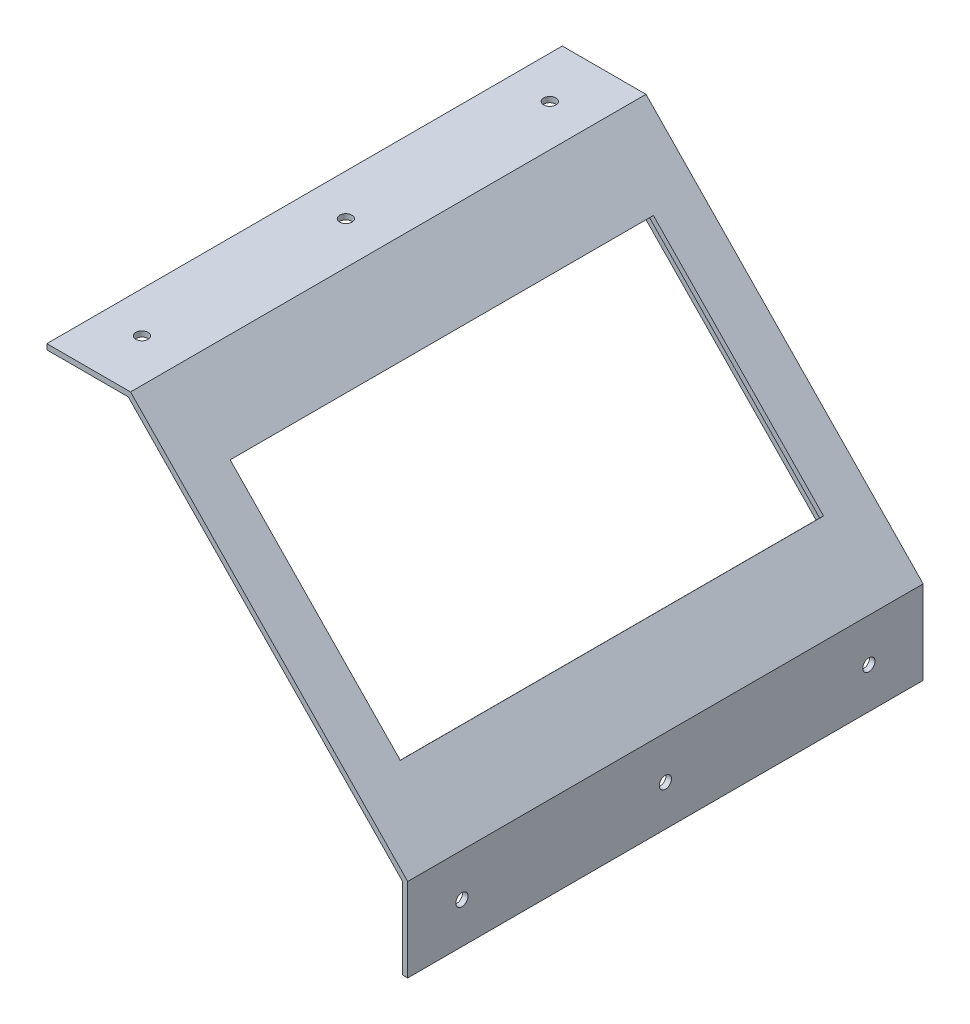
ISO-10303-21;
HEADER;
FILE_DESCRIPTION(('STEP AP214'),'2;1');
FILE_NAME('part.step','',(''),(''),'','','');
FILE_SCHEMA(('AUTOMOTIVE_DESIGN { 1 0 10303 214 1 1 1 1 }'));
ENDSEC;
DATA;
#1=APPLICATION_CONTEXT('core data for automotive mechanical design processes');
#2=APPLICATION_PROTOCOL_DEFINITION('international standard','automotive_design',2000,#1);
#3=PRODUCT_CONTEXT('',#1,'mechanical');
#4=PRODUCT('Part','Part','',(#3));
#5=PRODUCT_RELATED_PRODUCT_CATEGORY('part','',(#4));
#6=PRODUCT_DEFINITION_FORMATION('','',#4);
#7=PRODUCT_DEFINITION_CONTEXT('part definition',#1,'design');
#8=PRODUCT_DEFINITION('design','',#6,#7);
#9=PRODUCT_DEFINITION_SHAPE('','',#8);
#10=(LENGTH_UNIT() NAMED_UNIT(*) SI_UNIT(.MILLI.,.METRE.));
#11=(NAMED_UNIT(*) PLANE_ANGLE_UNIT() SI_UNIT($,.RADIAN.));
#12=(NAMED_UNIT(*) SI_UNIT($,.STERADIAN.) SOLID_ANGLE_UNIT());
#13=UNCERTAINTY_MEASURE_WITH_UNIT(LENGTH_MEASURE(1.E-05),#10,'distance_accuracy_value','');
#14=(GEOMETRIC_REPRESENTATION_CONTEXT(3) GLOBAL_UNCERTAINTY_ASSIGNED_CONTEXT((#13)) GLOBAL_UNIT_ASSIGNED_CONTEXT((#10,
#11,#12)) REPRESENTATION_CONTEXT('',''));
#15=CARTESIAN_POINT('',(0.,0.,0.));
#16=DIRECTION('',(0.,0.,1.));
#17=DIRECTION('',(1.,0.,0.));
#18=AXIS2_PLACEMENT_3D('',#15,#16,#17);
#19=CARTESIAN_POINT('',(-64.5,38.,95.));
#20=DIRECTION('',(0.,0.,1.));
#21=DIRECTION('',(1.,0.,0.));
#22=AXIS2_PLACEMENT_3D('',#19,#20,#21);
#23=PLANE('',#22);
#24=DIRECTION('',(1.,0.,0.));
#25=VECTOR('',#24,1.);
#26=CARTESIAN_POINT('',(-131.,104.,95.));
#27=LINE('',#26,#25);
#28=CARTESIAN_POINT('',(-131.,104.,95.));
#29=VERTEX_POINT('',#28);
#30=CARTESIAN_POINT('',(-101.,104.,95.));
#31=VERTEX_POINT('',#30);
#32=EDGE_CURVE('E10',#29,#31,#27,.T.);
#33=ORIENTED_EDGE('',*,*,#32,.T.);
#34=DIRECTION('',(0.696684280725865,-0.717377873222672,0.));
#35=VECTOR('',#34,1.);
#36=CARTESIAN_POINT('',(-101.,104.,95.));
#37=LINE('',#36,#35);
#38=CARTESIAN_POINT('',(0.,0.,95.));
#39=VERTEX_POINT('',#38);
#40=EDGE_CURVE('E324',#31,#39,#37,.T.);
#41=ORIENTED_EDGE('',*,*,#40,.T.);
#42=DIRECTION('',(0.,-1.,0.));
#43=VECTOR('',#42,1.);
#44=CARTESIAN_POINT('',(0.,0.,95.));
#45=LINE('',#44,#43);
#46=CARTESIAN_POINT('',(0.,-30.,95.));
#47=VERTEX_POINT('',#46);
#48=EDGE_CURVE('E25',#39,#47,#45,.T.);
#49=ORIENTED_EDGE('',*,*,#48,.T.);
#50=DIRECTION('',(1.,0.,0.));
#51=VECTOR('',#50,1.);
#52=CARTESIAN_POINT('',(0.,-30.,95.));
#53=LINE('',#52,#51);
#54=CARTESIAN_POINT('',(2.,-30.,95.));
#55=VERTEX_POINT('',#54);
#56=EDGE_CURVE('E47',#47,#55,#53,.T.);
#57=ORIENTED_EDGE('',*,*,#56,.T.);
#58=DIRECTION('',(0.,1.,0.));
#59=VECTOR('',#58,1.);
#60=CARTESIAN_POINT('',(2.,-30.,95.));
#61=LINE('',#60,#59);
#62=CARTESIAN_POINT('',(2.,0.811334874623189,95.));
#63=VERTEX_POINT('',#62);
#64=EDGE_CURVE('E337',#55,#63,#61,.T.);
#65=ORIENTED_EDGE('',*,*,#64,.T.);
#66=DIRECTION('',(-0.696684280725865,0.717377873222672,0.));
#67=VECTOR('',#66,1.);
#68=CARTESIAN_POINT('',(2.,0.811334874623189,95.));
#69=LINE('',#68,#67);
#70=CARTESIAN_POINT('',(-100.154376708299,106.,95.));
#71=VERTEX_POINT('',#70);
#72=EDGE_CURVE('E370',#63,#71,#69,.T.);
#73=ORIENTED_EDGE('',*,*,#72,.T.);
#74=DIRECTION('',(-1.,0.,0.));
#75=VECTOR('',#74,1.);
#76=CARTESIAN_POINT('',(-100.154376708299,106.,95.));
#77=LINE('',#76,#75);
#78=CARTESIAN_POINT('',(-131.,106.,95.));
#79=VERTEX_POINT('',#78);
#80=EDGE_CURVE('E371',#71,#79,#77,.T.);
#81=ORIENTED_EDGE('',*,*,#80,.T.);
#82=DIRECTION('',(0.,-1.,0.));
#83=VECTOR('',#82,1.);
#84=CARTESIAN_POINT('',(-131.,106.,95.));
#85=LINE('',#84,#83);
#86=EDGE_CURVE('E291',#79,#29,#85,.T.);
#87=ORIENTED_EDGE('',*,*,#86,.T.);
#88=EDGE_LOOP('',(#33,#41,#49,#57,#65,#73,#81,#87));
#89=FACE_BOUND('',#88,.T.);
#90=ADVANCED_FACE('F15',(#89),#23,.T.);
#91=CARTESIAN_POINT('',(-131.,104.,0.));
#92=DIRECTION('',(0.,-1.,0.));
#93=DIRECTION('',(0.,0.,-1.));
#94=AXIS2_PLACEMENT_3D('',#91,#92,#93);
#95=PLANE('',#94);
#96=CARTESIAN_POINT('',(-115.621694843186,104.,-75.));
#97=DIRECTION('',(0.,1.,0.));
#98=DIRECTION('',(1.,0.,0.));
#99=AXIS2_PLACEMENT_3D('',#96,#97,#98);
#100=CIRCLE('',#99,2.25);
#101=CARTESIAN_POINT('',(-117.871694843186,104.,-75.));
#102=VERTEX_POINT('',#101);
#103=EDGE_CURVE('E261',#102,#102,#100,.T.);
#104=ORIENTED_EDGE('',*,*,#103,.T.);
#105=EDGE_LOOP('',(#104));
#106=FACE_BOUND('',#105,.T.);
#107=CARTESIAN_POINT('',(-115.788594177075,104.,0.));
#108=DIRECTION('',(0.,1.,0.));
#109=DIRECTION('',(1.,0.,0.));
#110=AXIS2_PLACEMENT_3D('',#107,#108,#109);
#111=CIRCLE('',#110,2.25);
#112=CARTESIAN_POINT('',(-118.038594177075,104.,0.));
#113=VERTEX_POINT('',#112);
#114=EDGE_CURVE('E272',#113,#113,#111,.T.);
#115=ORIENTED_EDGE('',*,*,#114,.T.);
#116=EDGE_LOOP('',(#115));
#117=FACE_BOUND('',#116,.T.);
#118=CARTESIAN_POINT('',(-115.955493510963,104.,75.));
#119=DIRECTION('',(0.,1.,0.));
#120=DIRECTION('',(1.,0.,0.));
#121=AXIS2_PLACEMENT_3D('',#118,#119,#120);
#122=CIRCLE('',#121,2.25);
#123=CARTESIAN_POINT('',(-118.205493510963,104.,75.));
#124=VERTEX_POINT('',#123);
#125=EDGE_CURVE('E426',#124,#124,#122,.T.);
#126=ORIENTED_EDGE('',*,*,#125,.T.);
#127=EDGE_LOOP('',(#126));
#128=FACE_BOUND('',#127,.T.);
#129=DIRECTION('',(0.,0.,1.));
#130=VECTOR('',#129,1.);
#131=CARTESIAN_POINT('',(-101.,104.,0.));
#132=LINE('',#131,#130);
#133=CARTESIAN_POINT('',(-101.,104.,-95.));
#134=VERTEX_POINT('',#133);
#135=EDGE_CURVE('E327',#134,#31,#132,.T.);
#136=ORIENTED_EDGE('',*,*,#135,.T.);
#137=ORIENTED_EDGE('',*,*,#32,.F.);
#138=DIRECTION('',(0.,0.,-1.));
#139=VECTOR('',#138,1.);
#140=CARTESIAN_POINT('',(-131.,104.,0.));
#141=LINE('',#140,#139);
#142=CARTESIAN_POINT('',(-131.,104.,-95.));
#143=VERTEX_POINT('',#142);
#144=EDGE_CURVE('E288',#29,#143,#141,.T.);
#145=ORIENTED_EDGE('',*,*,#144,.T.);
#146=DIRECTION('',(-1.,0.,0.));
#147=VECTOR('',#146,1.);
#148=CARTESIAN_POINT('',(-131.,104.,-95.));
#149=LINE('',#148,#147);
#150=EDGE_CURVE('E390',#134,#143,#149,.T.);
#151=ORIENTED_EDGE('',*,*,#150,.F.);
#152=EDGE_LOOP('',(#136,#137,#145,#151));
#153=FACE_BOUND('',#152,.T.);
#154=ADVANCED_FACE('F605',(#106,#117,#128,#153),#95,.T.);
#155=CARTESIAN_POINT('',(-101.,104.,0.));
#156=DIRECTION('',(-0.717377873222672,-0.696684280725865,0.));
#157=DIRECTION('',(-0.696684280725865,0.717377873222672,0.));
#158=AXIS2_PLACEMENT_3D('',#155,#156,#157);
#159=PLANE('',#158);
#160=DIRECTION('',(-0.696684280725865,0.717377873222672,0.));
#161=VECTOR('',#160,1.);
#162=CARTESIAN_POINT('',(-91.4313683666293,94.1471515854401,-78.));
#163=LINE('',#162,#161);
#164=CARTESIAN_POINT('',(-19.1611514679308,19.7302945808396,-78.));
#165=VERTEX_POINT('',#164);
#166=CARTESIAN_POINT('',(-81.8627367332586,84.2943031708801,-78.));
#167=VERTEX_POINT('',#166);
#168=EDGE_CURVE('E313',#165,#167,#163,.T.);
#169=ORIENTED_EDGE('',*,*,#168,.T.);
#170=DIRECTION('',(0.,0.,1.));
#171=VECTOR('',#170,1.);
#172=CARTESIAN_POINT('',(-81.8627367332586,84.2943031708801,39.));
#173=LINE('',#172,#171);
#174=CARTESIAN_POINT('',(-81.8627367332586,84.2943031708801,78.));
#175=VERTEX_POINT('',#174);
#176=EDGE_CURVE('E323',#167,#175,#173,.T.);
#177=ORIENTED_EDGE('',*,*,#176,.T.);
#178=DIRECTION('',(0.696684280725865,-0.717377873222672,0.));
#179=VECTOR('',#178,1.);
#180=CARTESIAN_POINT('',(-60.0805757339654,61.8651472904198,78.));
#181=LINE('',#180,#179);
#182=CARTESIAN_POINT('',(-19.1611514679308,19.7302945808396,78.));
#183=VERTEX_POINT('',#182);
#184=EDGE_CURVE('E312',#175,#183,#181,.T.);
#185=ORIENTED_EDGE('',*,*,#184,.T.);
#186=DIRECTION('',(0.,0.,-1.));
#187=VECTOR('',#186,1.);
#188=CARTESIAN_POINT('',(-19.1611514679307,19.7302945808396,-39.));
#189=LINE('',#188,#187);
#190=EDGE_CURVE('E398',#183,#165,#189,.T.);
#191=ORIENTED_EDGE('',*,*,#190,.T.);
#192=EDGE_LOOP('',(#169,#177,#185,#191));
#193=FACE_BOUND('',#192,.T.);
#194=DIRECTION('',(0.696684280725865,-0.717377873222672,0.));
#195=VECTOR('',#194,1.);
#196=CARTESIAN_POINT('',(-57.4680096812434,59.1749802658348,-82.));
#197=LINE('',#196,#195);
#198=CARTESIAN_POINT('',(-85.6945002772509,88.2398814736048,-82.));
#199=VERTEX_POINT('',#198);
#200=CARTESIAN_POINT('',(-13.9360193624868,14.3499605316695,-82.));
#201=VERTEX_POINT('',#200);
#202=EDGE_CURVE('E402',#199,#201,#197,.T.);
#203=ORIENTED_EDGE('',*,*,#202,.T.);
#204=DIRECTION('',(0.,0.,1.));
#205=VECTOR('',#204,1.);
#206=CARTESIAN_POINT('',(-13.9360193624868,14.3499605316695,42.5));
#207=LINE('',#206,#205);
#208=CARTESIAN_POINT('',(-13.9360193624868,14.3499605316696,85.));
#209=VERTEX_POINT('',#208);
#210=EDGE_CURVE('E302',#201,#209,#207,.T.);
#211=ORIENTED_EDGE('',*,*,#210,.T.);
#212=DIRECTION('',(-0.696684280725865,0.717377873222672,0.));
#213=VECTOR('',#212,1.);
#214=CARTESIAN_POINT('',(-93.3472501386254,96.1199407368024,85.));
#215=LINE('',#214,#213);
#216=CARTESIAN_POINT('',(-85.6945002772508,88.2398814736048,85.));
#217=VERTEX_POINT('',#216);
#218=EDGE_CURVE('E332',#209,#217,#215,.T.);
#219=ORIENTED_EDGE('',*,*,#218,.T.);
#220=DIRECTION('',(0.,0.,-1.));
#221=VECTOR('',#220,1.);
#222=CARTESIAN_POINT('',(-85.6945002772509,88.2398814736048,-41.));
#223=LINE('',#222,#221);
#224=EDGE_CURVE('E347',#217,#199,#223,.T.);
#225=ORIENTED_EDGE('',*,*,#224,.T.);
#226=EDGE_LOOP('',(#203,#211,#219,#225));
#227=FACE_BOUND('',#226,.T.);
#228=ADVANCED_FACE('F610',(#193,#227),#159,.T.);
#229=CARTESIAN_POINT('',(0.,0.,0.));
#230=DIRECTION('',(-1.,0.,0.));
#231=DIRECTION('',(0.,0.,1.));
#232=AXIS2_PLACEMENT_3D('',#229,#230,#231);
#233=PLANE('',#232);
#234=CARTESIAN_POINT('',(0.,-15.,-75.));
#235=DIRECTION('',(1.,0.,0.));
#236=DIRECTION('',(0.,0.,1.));
#237=AXIS2_PLACEMENT_3D('',#234,#235,#236);
#238=CIRCLE('',#237,2.25);
#239=CARTESIAN_POINT('',(0.,-15.,-77.25));
#240=VERTEX_POINT('',#239);
#241=EDGE_CURVE('E411',#240,#240,#238,.T.);
#242=ORIENTED_EDGE('',*,*,#241,.T.);
#243=EDGE_LOOP('',(#242));
#244=FACE_BOUND('',#243,.T.);
#245=CARTESIAN_POINT('',(0.,-15.,0.));
#246=DIRECTION('',(1.,0.,0.));
#247=DIRECTION('',(0.,0.,1.));
#248=AXIS2_PLACEMENT_3D('',#245,#246,#247);
#249=CIRCLE('',#248,2.25);
#250=CARTESIAN_POINT('',(0.,-15.,-2.25));
#251=VERTEX_POINT('',#250);
#252=EDGE_CURVE('E380',#251,#251,#249,.T.);
#253=ORIENTED_EDGE('',*,*,#252,.T.);
#254=EDGE_LOOP('',(#253));
#255=FACE_BOUND('',#254,.T.);
#256=CARTESIAN_POINT('',(0.,-15.,75.));
#257=DIRECTION('',(1.,0.,0.));
#258=DIRECTION('',(0.,0.,1.));
#259=AXIS2_PLACEMENT_3D('',#256,#257,#258);
#260=CIRCLE('',#259,2.25);
#261=CARTESIAN_POINT('',(0.,-15.,72.75));
#262=VERTEX_POINT('',#261);
#263=EDGE_CURVE('E346',#262,#262,#260,.T.);
#264=ORIENTED_EDGE('',*,*,#263,.T.);
#265=EDGE_LOOP('',(#264));
#266=FACE_BOUND('',#265,.T.);
#267=DIRECTION('',(0.,0.,1.));
#268=VECTOR('',#267,1.);
#269=CARTESIAN_POINT('',(0.,-30.,0.));
#270=LINE('',#269,#268);
#271=CARTESIAN_POINT('',(0.,-30.,-95.));
#272=VERTEX_POINT('',#271);
#273=EDGE_CURVE('E356',#272,#47,#270,.T.);
#274=ORIENTED_EDGE('',*,*,#273,.T.);
#275=ORIENTED_EDGE('',*,*,#48,.F.);
#276=DIRECTION('',(0.,0.,1.));
#277=VECTOR('',#276,1.);
#278=CARTESIAN_POINT('',(0.,0.,0.));
#279=LINE('',#278,#277);
#280=CARTESIAN_POINT('',(0.,0.,-95.));
#281=VERTEX_POINT('',#280);
#282=EDGE_CURVE('E328',#281,#39,#279,.T.);
#283=ORIENTED_EDGE('',*,*,#282,.F.);
#284=DIRECTION('',(0.,1.,0.));
#285=VECTOR('',#284,1.);
#286=CARTESIAN_POINT('',(0.,0.,-95.));
#287=LINE('',#286,#285);
#288=EDGE_CURVE('E292',#272,#281,#287,.T.);
#289=ORIENTED_EDGE('',*,*,#288,.F.);
#290=EDGE_LOOP('',(#274,#275,#283,#289));
#291=FACE_BOUND('',#290,.T.);
#292=ADVANCED_FACE('F652',(#244,#255,#266,#291),#233,.T.);
#293=CARTESIAN_POINT('',(0.,-30.,0.));
#294=DIRECTION('',(0.,-1.,0.));
#295=DIRECTION('',(0.,0.,-1.));
#296=AXIS2_PLACEMENT_3D('',#293,#294,#295);
#297=PLANE('',#296);
#298=DIRECTION('',(0.,0.,1.));
#299=VECTOR('',#298,1.);
#300=CARTESIAN_POINT('',(2.,-30.,0.));
#301=LINE('',#300,#299);
#302=CARTESIAN_POINT('',(2.,-30.,-95.));
#303=VERTEX_POINT('',#302);
#304=EDGE_CURVE('E340',#303,#55,#301,.T.);
#305=ORIENTED_EDGE('',*,*,#304,.T.);
#306=ORIENTED_EDGE('',*,*,#56,.F.);
#307=ORIENTED_EDGE('',*,*,#273,.F.);
#308=DIRECTION('',(-1.,0.,0.));
#309=VECTOR('',#308,1.);
#310=CARTESIAN_POINT('',(0.,-30.,-95.));
#311=LINE('',#310,#309);
#312=EDGE_CURVE('E446',#303,#272,#311,.T.);
#313=ORIENTED_EDGE('',*,*,#312,.F.);
#314=EDGE_LOOP('',(#305,#306,#307,#313));
#315=FACE_BOUND('',#314,.T.);
#316=ADVANCED_FACE('F615',(#315),#297,.T.);
#317=CARTESIAN_POINT('',(2.,-30.,0.));
#318=DIRECTION('',(1.,0.,0.));
#319=DIRECTION('',(0.,1.,0.));
#320=AXIS2_PLACEMENT_3D('',#317,#318,#319);
#321=PLANE('',#320);
#322=CARTESIAN_POINT('',(2.,-15.,-75.));
#323=DIRECTION('',(-1.,0.,0.));
#324=DIRECTION('',(0.,0.,1.));
#325=AXIS2_PLACEMENT_3D('',#322,#323,#324);
#326=CIRCLE('',#325,2.25);
#327=CARTESIAN_POINT('',(2.,-15.,-77.25));
#328=VERTEX_POINT('',#327);
#329=EDGE_CURVE('E297',#328,#328,#326,.T.);
#330=ORIENTED_EDGE('',*,*,#329,.T.);
#331=EDGE_LOOP('',(#330));
#332=FACE_BOUND('',#331,.T.);
#333=CARTESIAN_POINT('',(2.,-15.,0.));
#334=DIRECTION('',(-1.,0.,0.));
#335=DIRECTION('',(0.,0.,1.));
#336=AXIS2_PLACEMENT_3D('',#333,#334,#335);
#337=CIRCLE('',#336,2.25);
#338=CARTESIAN_POINT('',(2.,-15.,-2.25));
#339=VERTEX_POINT('',#338);
#340=EDGE_CURVE('E379',#339,#339,#337,.T.);
#341=ORIENTED_EDGE('',*,*,#340,.T.);
#342=EDGE_LOOP('',(#341));
#343=FACE_BOUND('',#342,.T.);
#344=CARTESIAN_POINT('',(2.,-15.,75.));
#345=DIRECTION('',(-1.,0.,0.));
#346=DIRECTION('',(0.,0.,1.));
#347=AXIS2_PLACEMENT_3D('',#344,#345,#346);
#348=CIRCLE('',#347,2.25);
#349=CARTESIAN_POINT('',(2.,-15.,72.75));
#350=VERTEX_POINT('',#349);
#351=EDGE_CURVE('E276',#350,#350,#348,.T.);
#352=ORIENTED_EDGE('',*,*,#351,.T.);
#353=EDGE_LOOP('',(#352));
#354=FACE_BOUND('',#353,.T.);
#355=DIRECTION('',(0.,0.,1.));
#356=VECTOR('',#355,1.);
#357=CARTESIAN_POINT('',(2.,0.81133487462318,0.));
#358=LINE('',#357,#356);
#359=CARTESIAN_POINT('',(2.,0.811334874623189,-95.));
#360=VERTEX_POINT('',#359);
#361=EDGE_CURVE('E341',#360,#63,#358,.T.);
#362=ORIENTED_EDGE('',*,*,#361,.T.);
#363=ORIENTED_EDGE('',*,*,#64,.F.);
#364=ORIENTED_EDGE('',*,*,#304,.F.);
#365=DIRECTION('',(0.,-1.,0.));
#366=VECTOR('',#365,1.);
#367=CARTESIAN_POINT('',(2.,-30.,-95.));
#368=LINE('',#367,#366);
#369=EDGE_CURVE('E442',#360,#303,#368,.T.);
#370=ORIENTED_EDGE('',*,*,#369,.F.);
#371=EDGE_LOOP('',(#362,#363,#364,#370));
#372=FACE_BOUND('',#371,.T.);
#373=ADVANCED_FACE('F1011',(#332,#343,#354,#372),#321,.T.);
#374=CARTESIAN_POINT('',(2.,0.81133487462318,0.));
#375=DIRECTION('',(0.717377873222672,0.696684280725865,0.));
#376=DIRECTION('',(0.,0.,-1.));
#377=AXIS2_PLACEMENT_3D('',#374,#375,#376);
#378=PLANE('',#377);
#379=DIRECTION('',(0.696684280725865,-0.717377873222672,0.));
#380=VECTOR('',#379,1.);
#381=CARTESIAN_POINT('',(-39.2139904934066,43.2495033034775,-78.));
#382=LINE('',#381,#380);
#383=CARTESIAN_POINT('',(-80.4279809868133,85.6876717323319,-78.));
#384=VERTEX_POINT('',#383);
#385=CARTESIAN_POINT('',(-17.7263957214854,21.1236631422913,-78.));
#386=VERTEX_POINT('',#385);
#387=EDGE_CURVE('E317',#384,#386,#382,.T.);
#388=ORIENTED_EDGE('',*,*,#387,.T.);
#389=DIRECTION('',(0.,0.,1.));
#390=VECTOR('',#389,1.);
#391=CARTESIAN_POINT('',(-17.7263957214854,21.1236631422913,-39.));
#392=LINE('',#391,#390);
#393=CARTESIAN_POINT('',(-17.7263957214854,21.1236631422913,78.));
#394=VERTEX_POINT('',#393);
#395=EDGE_CURVE('E395',#386,#394,#392,.T.);
#396=ORIENTED_EDGE('',*,*,#395,.T.);
#397=DIRECTION('',(-0.696684280725865,0.717377873222672,0.));
#398=VECTOR('',#397,1.);
#399=CARTESIAN_POINT('',(-7.8631978607427,10.9674990084573,78.));
#400=LINE('',#399,#398);
#401=CARTESIAN_POINT('',(-80.4279809868132,85.6876717323319,78.));
#402=VERTEX_POINT('',#401);
#403=EDGE_CURVE('E311',#394,#402,#400,.T.);
#404=ORIENTED_EDGE('',*,*,#403,.T.);
#405=DIRECTION('',(0.,0.,-1.));
#406=VECTOR('',#405,1.);
#407=CARTESIAN_POINT('',(-80.4279809868132,85.6876717323319,39.));
#408=LINE('',#407,#406);
#409=EDGE_CURVE('E387',#402,#384,#408,.T.);
#410=ORIENTED_EDGE('',*,*,#409,.T.);
#411=EDGE_LOOP('',(#388,#396,#404,#410));
#412=FACE_BOUND('',#411,.T.);
#413=DIRECTION('',(0.,0.,1.));
#414=VECTOR('',#413,1.);
#415=CARTESIAN_POINT('',(-100.154376708299,106.,0.));
#416=LINE('',#415,#414);
#417=CARTESIAN_POINT('',(-100.154376708299,106.,-95.));
#418=VERTEX_POINT('',#417);
#419=EDGE_CURVE('E366',#418,#71,#416,.T.);
#420=ORIENTED_EDGE('',*,*,#419,.T.);
#421=ORIENTED_EDGE('',*,*,#72,.F.);
#422=ORIENTED_EDGE('',*,*,#361,.F.);
#423=DIRECTION('',(0.696684280725865,-0.717377873222672,0.));
#424=VECTOR('',#423,1.);
#425=CARTESIAN_POINT('',(2.,0.811334874623189,-95.));
#426=LINE('',#425,#424);
#427=EDGE_CURVE('E447',#418,#360,#426,.T.);
#428=ORIENTED_EDGE('',*,*,#427,.F.);
#429=EDGE_LOOP('',(#420,#421,#422,#428));
#430=FACE_BOUND('',#429,.T.);
#431=ADVANCED_FACE('F1033',(#412,#430),#378,.T.);
#432=CARTESIAN_POINT('',(-100.154376708299,106.,0.));
#433=DIRECTION('',(0.,1.,0.));
#434=DIRECTION('',(1.,0.,0.));
#435=AXIS2_PLACEMENT_3D('',#432,#433,#434);
#436=PLANE('',#435);
#437=CARTESIAN_POINT('',(-115.621694843186,106.,-75.));
#438=DIRECTION('',(0.,-1.,0.));
#439=DIRECTION('',(1.,0.,0.));
#440=AXIS2_PLACEMENT_3D('',#437,#438,#439);
#441=CIRCLE('',#440,2.25);
#442=CARTESIAN_POINT('',(-117.871694843186,106.,-75.));
#443=VERTEX_POINT('',#442);
#444=EDGE_CURVE('E530',#443,#443,#441,.T.);
#445=ORIENTED_EDGE('',*,*,#444,.T.);
#446=EDGE_LOOP('',(#445));
#447=FACE_BOUND('',#446,.T.);
#448=CARTESIAN_POINT('',(-115.788594177075,106.,0.));
#449=DIRECTION('',(0.,-1.,0.));
#450=DIRECTION('',(1.,0.,0.));
#451=AXIS2_PLACEMENT_3D('',#448,#449,#450);
#452=CIRCLE('',#451,2.25);
#453=CARTESIAN_POINT('',(-118.038594177075,106.,0.));
#454=VERTEX_POINT('',#453);
#455=EDGE_CURVE('E255',#454,#454,#452,.T.);
#456=ORIENTED_EDGE('',*,*,#455,.T.);
#457=EDGE_LOOP('',(#456));
#458=FACE_BOUND('',#457,.T.);
#459=CARTESIAN_POINT('',(-115.955493510963,106.,75.));
#460=DIRECTION('',(0.,-1.,0.));
#461=DIRECTION('',(1.,0.,0.));
#462=AXIS2_PLACEMENT_3D('',#459,#460,#461);
#463=CIRCLE('',#462,2.25);
#464=CARTESIAN_POINT('',(-118.205493510963,106.,75.));
#465=VERTEX_POINT('',#464);
#466=EDGE_CURVE('E352',#465,#465,#463,.T.);
#467=ORIENTED_EDGE('',*,*,#466,.T.);
#468=EDGE_LOOP('',(#467));
#469=FACE_BOUND('',#468,.T.);
#470=DIRECTION('',(0.,0.,1.));
#471=VECTOR('',#470,1.);
#472=CARTESIAN_POINT('',(-131.,106.,0.));
#473=LINE('',#472,#471);
#474=CARTESIAN_POINT('',(-131.,106.,-95.));
#475=VERTEX_POINT('',#474);
#476=EDGE_CURVE('E391',#475,#79,#473,.T.);
#477=ORIENTED_EDGE('',*,*,#476,.T.);
#478=ORIENTED_EDGE('',*,*,#80,.F.);
#479=ORIENTED_EDGE('',*,*,#419,.F.);
#480=DIRECTION('',(1.,0.,0.));
#481=VECTOR('',#480,1.);
#482=CARTESIAN_POINT('',(-100.154376708299,106.,-95.));
#483=LINE('',#482,#481);
#484=EDGE_CURVE('E19',#475,#418,#483,.T.);
#485=ORIENTED_EDGE('',*,*,#484,.F.);
#486=EDGE_LOOP('',(#477,#478,#479,#485));
#487=FACE_BOUND('',#486,.T.);
#488=ADVANCED_FACE('F256',(#447,#458,#469,#487),#436,.T.);
#489=CARTESIAN_POINT('',(-131.,106.,0.));
#490=DIRECTION('',(-1.,0.,0.));
#491=DIRECTION('',(0.,0.,1.));
#492=AXIS2_PLACEMENT_3D('',#489,#490,#491);
#493=PLANE('',#492);
#494=ORIENTED_EDGE('',*,*,#144,.F.);
#495=ORIENTED_EDGE('',*,*,#86,.F.);
#496=ORIENTED_EDGE('',*,*,#476,.F.);
#497=DIRECTION('',(0.,1.,0.));
#498=VECTOR('',#497,1.);
#499=CARTESIAN_POINT('',(-131.,106.,-95.));
#500=LINE('',#499,#498);
#501=EDGE_CURVE('E441',#143,#475,#500,.T.);
#502=ORIENTED_EDGE('',*,*,#501,.F.);
#503=EDGE_LOOP('',(#494,#495,#496,#502));
#504=FACE_BOUND('',#503,.T.);
#505=ADVANCED_FACE('F662',(#504),#493,.T.);
#506=CARTESIAN_POINT('',(-64.5,38.,-95.));
#507=DIRECTION('',(0.,0.,-1.));
#508=DIRECTION('',(0.,-1.,0.));
#509=AXIS2_PLACEMENT_3D('',#506,#507,#508);
#510=PLANE('',#509);
#511=ORIENTED_EDGE('',*,*,#150,.T.);
#512=ORIENTED_EDGE('',*,*,#501,.T.);
#513=ORIENTED_EDGE('',*,*,#484,.T.);
#514=ORIENTED_EDGE('',*,*,#427,.T.);
#515=ORIENTED_EDGE('',*,*,#369,.T.);
#516=ORIENTED_EDGE('',*,*,#312,.T.);
#517=ORIENTED_EDGE('',*,*,#288,.T.);
#518=DIRECTION('',(-0.696684280725865,0.717377873222672,0.));
#519=VECTOR('',#518,1.);
#520=CARTESIAN_POINT('',(-101.,104.,-95.));
#521=LINE('',#520,#519);
#522=EDGE_CURVE('E336',#281,#134,#521,.T.);
#523=ORIENTED_EDGE('',*,*,#522,.T.);
#524=EDGE_LOOP('',(#511,#512,#513,#514,#515,#516,#517,#523));
#525=FACE_BOUND('',#524,.T.);
#526=ADVANCED_FACE('F664',(#525),#510,.T.);
#527=CARTESIAN_POINT('',(-80.4279809868132,85.6876717323319,78.));
#528=DIRECTION('',(-0.696684280725865,0.717377873222672,0.));
#529=DIRECTION('',(0.,0.,1.));
#530=AXIS2_PLACEMENT_3D('',#527,#528,#529);
#531=PLANE('',#530);
#532=ORIENTED_EDGE('',*,*,#176,.F.);
#533=DIRECTION('',(-0.717377873222672,-0.696684280725865,0.));
#534=VECTOR('',#533,1.);
#535=CARTESIAN_POINT('',(-80.4279809868133,85.6876717323319,-78.));
#536=LINE('',#535,#534);
#537=EDGE_CURVE('E319',#384,#167,#536,.T.);
#538=ORIENTED_EDGE('',*,*,#537,.F.);
#539=ORIENTED_EDGE('',*,*,#409,.F.);
#540=DIRECTION('',(-0.717377873222672,-0.696684280725865,0.));
#541=VECTOR('',#540,1.);
#542=CARTESIAN_POINT('',(-80.4279809868132,85.6876717323319,78.));
#543=LINE('',#542,#541);
#544=EDGE_CURVE('E307',#402,#175,#543,.T.);
#545=ORIENTED_EDGE('',*,*,#544,.T.);
#546=EDGE_LOOP('',(#532,#538,#539,#545));
#547=FACE_BOUND('',#546,.T.);
#548=ADVANCED_FACE('F667',(#547),#531,.F.);
#549=CARTESIAN_POINT('',(-80.4279809868133,85.6876717323319,-78.));
#550=DIRECTION('',(0.,0.,-1.));
#551=DIRECTION('',(0.,-1.,0.));
#552=AXIS2_PLACEMENT_3D('',#549,#550,#551);
#553=PLANE('',#552);
#554=ORIENTED_EDGE('',*,*,#168,.F.);
#555=DIRECTION('',(-0.717377873222672,-0.696684280725865,0.));
#556=VECTOR('',#555,1.);
#557=CARTESIAN_POINT('',(-17.7263957214854,21.1236631422913,-78.));
#558=LINE('',#557,#556);
#559=EDGE_CURVE('E318',#386,#165,#558,.T.);
#560=ORIENTED_EDGE('',*,*,#559,.F.);
#561=ORIENTED_EDGE('',*,*,#387,.F.);
#562=ORIENTED_EDGE('',*,*,#537,.T.);
#563=EDGE_LOOP('',(#554,#560,#561,#562));
#564=FACE_BOUND('',#563,.T.);
#565=ADVANCED_FACE('F637',(#564),#553,.F.);
#566=CARTESIAN_POINT('',(-17.7263957214854,21.1236631422913,-78.));
#567=DIRECTION('',(0.696684280725865,-0.717377873222672,0.));
#568=DIRECTION('',(0.,0.,-1.));
#569=AXIS2_PLACEMENT_3D('',#566,#567,#568);
#570=PLANE('',#569);
#571=ORIENTED_EDGE('',*,*,#190,.F.);
#572=DIRECTION('',(-0.717377873222672,-0.696684280725865,0.));
#573=VECTOR('',#572,1.);
#574=CARTESIAN_POINT('',(-17.7263957214854,21.1236631422913,78.));
#575=LINE('',#574,#573);
#576=EDGE_CURVE('E505',#394,#183,#575,.T.);
#577=ORIENTED_EDGE('',*,*,#576,.F.);
#578=ORIENTED_EDGE('',*,*,#395,.F.);
#579=ORIENTED_EDGE('',*,*,#559,.T.);
#580=EDGE_LOOP('',(#571,#577,#578,#579));
#581=FACE_BOUND('',#580,.T.);
#582=ADVANCED_FACE('F634',(#581),#570,.F.);
#583=CARTESIAN_POINT('',(-17.7263957214854,21.1236631422913,78.));
#584=DIRECTION('',(0.,0.,1.));
#585=DIRECTION('',(1.,0.,0.));
#586=AXIS2_PLACEMENT_3D('',#583,#584,#585);
#587=PLANE('',#586);
#588=ORIENTED_EDGE('',*,*,#184,.F.);
#589=ORIENTED_EDGE('',*,*,#544,.F.);
#590=ORIENTED_EDGE('',*,*,#403,.F.);
#591=ORIENTED_EDGE('',*,*,#576,.T.);
#592=EDGE_LOOP('',(#588,#589,#590,#591));
#593=FACE_BOUND('',#592,.T.);
#594=ADVANCED_FACE('F636',(#593),#587,.F.);
#595=CARTESIAN_POINT('',(-101.,104.,0.));
#596=DIRECTION('',(-0.717377873222672,-0.696684280725865,0.));
#597=DIRECTION('',(-0.696684280725865,0.717377873222672,0.));
#598=AXIS2_PLACEMENT_3D('',#595,#596,#597);
#599=PLANE('',#598);
#600=DIRECTION('',(-0.696684280725865,0.717377873222672,0.));
#601=VECTOR('',#600,1.);
#602=CARTESIAN_POINT('',(-97.1790136826177,100.065519039527,-85.));
#603=LINE('',#602,#601);
#604=CARTESIAN_POINT('',(-6.27249227450227,6.45880392622016,-85.));
#605=VERTEX_POINT('',#604);
#606=CARTESIAN_POINT('',(-93.3580273652353,96.1310380790542,-85.));
#607=VERTEX_POINT('',#606);
#608=EDGE_CURVE('E491',#605,#607,#603,.T.);
#609=ORIENTED_EDGE('',*,*,#608,.T.);
#610=DIRECTION('',(0.,0.,1.));
#611=VECTOR('',#610,1.);
#612=CARTESIAN_POINT('',(-93.3580273652353,96.1310380790542,44.));
#613=LINE('',#612,#611);
#614=CARTESIAN_POINT('',(-93.3580273652353,96.1310380790542,88.));
#615=VERTEX_POINT('',#614);
#616=EDGE_CURVE('E88',#607,#615,#613,.T.);
#617=ORIENTED_EDGE('',*,*,#616,.T.);
#618=DIRECTION('',(0.696684280725865,-0.717377873222672,0.));
#619=VECTOR('',#618,1.);
#620=CARTESIAN_POINT('',(-53.6362461372511,55.2294019631101,88.));
#621=LINE('',#620,#619);
#622=CARTESIAN_POINT('',(-6.27249227450225,6.45880392622013,88.));
#623=VERTEX_POINT('',#622);
#624=EDGE_CURVE('E499',#615,#623,#621,.T.);
#625=ORIENTED_EDGE('',*,*,#624,.T.);
#626=DIRECTION('',(0.,0.,-1.));
#627=VECTOR('',#626,1.);
#628=CARTESIAN_POINT('',(-6.27249227450225,6.45880392622014,-42.5));
#629=LINE('',#628,#627);
#630=EDGE_CURVE('E285',#623,#605,#629,.T.);
#631=ORIENTED_EDGE('',*,*,#630,.T.);
#632=EDGE_LOOP('',(#609,#617,#625,#631));
#633=FACE_BOUND('',#632,.T.);
#634=ORIENTED_EDGE('',*,*,#282,.T.);
#635=ORIENTED_EDGE('',*,*,#40,.F.);
#636=ORIENTED_EDGE('',*,*,#135,.F.);
#637=ORIENTED_EDGE('',*,*,#522,.F.);
#638=EDGE_LOOP('',(#634,#635,#636,#637));
#639=FACE_BOUND('',#638,.T.);
#640=ADVANCED_FACE('F648',(#633,#639),#599,.T.);
#641=CARTESIAN_POINT('',(-55.1955938690388,46.0697888971932,1.5));
#642=DIRECTION('',(-0.717377873222673,-0.696684280725865,0.));
#643=DIRECTION('',(-0.696684280725865,0.717377873222673,0.));
#644=AXIS2_PLACEMENT_3D('',#641,#642,#643);
#645=PLANE('',#644);
#646=DIRECTION('',(0.,0.,1.));
#647=VECTOR('',#646,1.);
#648=CARTESIAN_POINT('',(-91.0748343264209,83.0147493681608,-82.));
#649=LINE('',#648,#647);
#650=CARTESIAN_POINT('',(-91.0748343264209,83.0147493681608,-82.));
#651=VERTEX_POINT('',#650);
#652=CARTESIAN_POINT('',(-91.0748343264209,83.0147493681608,85.));
#653=VERTEX_POINT('',#652);
#654=EDGE_CURVE('E350',#651,#653,#649,.T.);
#655=ORIENTED_EDGE('',*,*,#654,.T.);
#656=DIRECTION('',(0.696684280725865,-0.717377873222672,0.));
#657=VECTOR('',#656,1.);
#658=CARTESIAN_POINT('',(-91.0748343264209,83.0147493681608,85.));
#659=LINE('',#658,#657);
#660=CARTESIAN_POINT('',(-19.3163534116568,9.12482842622557,85.));
#661=VERTEX_POINT('',#660);
#662=EDGE_CURVE('E408',#653,#661,#659,.T.);
#663=ORIENTED_EDGE('',*,*,#662,.T.);
#664=DIRECTION('',(0.,0.,-1.));
#665=VECTOR('',#664,1.);
#666=CARTESIAN_POINT('',(-19.3163534116568,9.12482842622557,85.));
#667=LINE('',#666,#665);
#668=CARTESIAN_POINT('',(-19.3163534116568,9.12482842622556,-82.));
#669=VERTEX_POINT('',#668);
#670=EDGE_CURVE('E298',#661,#669,#667,.T.);
#671=ORIENTED_EDGE('',*,*,#670,.T.);
#672=DIRECTION('',(-0.696684280725865,0.717377873222672,0.));
#673=VECTOR('',#672,1.);
#674=CARTESIAN_POINT('',(-19.3163534116568,9.12482842622556,-82.));
#675=LINE('',#674,#673);
#676=EDGE_CURVE('E381',#669,#651,#675,.T.);
#677=ORIENTED_EDGE('',*,*,#676,.T.);
#678=EDGE_LOOP('',(#655,#663,#671,#677));
#679=FACE_BOUND('',#678,.T.);
#680=CARTESIAN_POINT('',(-15.1362477273017,4.82056118688953,80.));
#681=DIRECTION('',(0.717377873222673,0.696684280725865,0.));
#682=DIRECTION('',(0.,0.,1.));
#683=AXIS2_PLACEMENT_3D('',#680,#681,#682);
#684=CIRCLE('',#683,1.);
#685=CARTESIAN_POINT('',(-15.1362477273017,4.82056118688953,79.));
#686=VERTEX_POINT('',#685);
#687=EDGE_CURVE('E483',#686,#686,#684,.T.);
#688=ORIENTED_EDGE('',*,*,#687,.T.);
#689=EDGE_LOOP('',(#688));
#690=FACE_BOUND('',#689,.T.);
#691=CARTESIAN_POINT('',(-95.2549400107761,87.3190166074969,80.));
#692=DIRECTION('',(0.717377873222673,0.696684280725865,0.));
#693=DIRECTION('',(0.,0.,1.));
#694=AXIS2_PLACEMENT_3D('',#691,#692,#693);
#695=CIRCLE('',#694,1.);
#696=CARTESIAN_POINT('',(-95.2549400107761,87.3190166074969,79.));
#697=VERTEX_POINT('',#696);
#698=EDGE_CURVE('E362',#697,#697,#695,.T.);
#699=ORIENTED_EDGE('',*,*,#698,.T.);
#700=EDGE_LOOP('',(#699));
#701=FACE_BOUND('',#700,.T.);
#702=CARTESIAN_POINT('',(-95.2549400107761,87.3190166074969,-77.));
#703=DIRECTION('',(0.717377873222673,0.696684280725865,0.));
#704=DIRECTION('',(0.,0.,1.));
#705=AXIS2_PLACEMENT_3D('',#702,#703,#704);
#706=CIRCLE('',#705,1.);
#707=CARTESIAN_POINT('',(-95.2549400107761,87.3190166074969,-78.));
#708=VERTEX_POINT('',#707);
#709=EDGE_CURVE('E281',#708,#708,#706,.T.);
#710=ORIENTED_EDGE('',*,*,#709,.T.);
#711=EDGE_LOOP('',(#710));
#712=FACE_BOUND('',#711,.T.);
#713=CARTESIAN_POINT('',(-15.1362477273016,4.82056118688951,-77.));
#714=DIRECTION('',(0.717377873222673,0.696684280725865,0.));
#715=DIRECTION('',(0.,0.,1.));
#716=AXIS2_PLACEMENT_3D('',#713,#714,#715);
#717=CIRCLE('',#716,1.);
#718=CARTESIAN_POINT('',(-15.1362477273016,4.82056118688951,-78.));
#719=VERTEX_POINT('',#718);
#720=EDGE_CURVE('E293',#719,#719,#717,.T.);
#721=ORIENTED_EDGE('',*,*,#720,.T.);
#722=EDGE_LOOP('',(#721));
#723=FACE_BOUND('',#722,.T.);
#724=DIRECTION('',(0.,0.,1.));
#725=VECTOR('',#724,1.);
#726=CARTESIAN_POINT('',(-11.6528263236723,1.23367182077617,-85.));
#727=LINE('',#726,#725);
#728=CARTESIAN_POINT('',(-11.6528263236723,1.23367182077617,-85.));
#729=VERTEX_POINT('',#728);
#730=CARTESIAN_POINT('',(-11.6528263236723,1.23367182077615,88.));
#731=VERTEX_POINT('',#730);
#732=EDGE_CURVE('E99',#729,#731,#727,.T.);
#733=ORIENTED_EDGE('',*,*,#732,.T.);
#734=DIRECTION('',(-0.696684280725865,0.717377873222672,0.));
#735=VECTOR('',#734,1.);
#736=CARTESIAN_POINT('',(-11.6528263236723,1.23367182077616,88.));
#737=LINE('',#736,#735);
#738=CARTESIAN_POINT('',(-98.7383614144054,90.9059059736102,88.));
#739=VERTEX_POINT('',#738);
#740=EDGE_CURVE('E286',#731,#739,#737,.T.);
#741=ORIENTED_EDGE('',*,*,#740,.T.);
#742=DIRECTION('',(0.,0.,-1.));
#743=VECTOR('',#742,1.);
#744=CARTESIAN_POINT('',(-98.7383614144054,90.9059059736102,88.));
#745=LINE('',#744,#743);
#746=CARTESIAN_POINT('',(-98.7383614144054,90.9059059736102,-85.));
#747=VERTEX_POINT('',#746);
#748=EDGE_CURVE('E305',#739,#747,#745,.T.);
#749=ORIENTED_EDGE('',*,*,#748,.T.);
#750=DIRECTION('',(0.696684280725865,-0.717377873222672,0.));
#751=VECTOR('',#750,1.);
#752=CARTESIAN_POINT('',(-98.7383614144054,90.9059059736102,-85.));
#753=LINE('',#752,#751);
#754=EDGE_CURVE('E432',#747,#729,#753,.T.);
#755=ORIENTED_EDGE('',*,*,#754,.T.);
#756=EDGE_LOOP('',(#733,#741,#749,#755));
#757=FACE_BOUND('',#756,.T.);
#758=ADVANCED_FACE('F582',(#679,#690,#701,#712,#723,#757),#645,.T.);
#759=CARTESIAN_POINT('',(-6.27249227450227,6.45880392622015,-85.));
#760=DIRECTION('',(0.696684280725865,-0.717377873222673,0.));
#761=DIRECTION('',(0.,0.,-1.));
#762=AXIS2_PLACEMENT_3D('',#759,#760,#761);
#763=PLANE('',#762);
#764=ORIENTED_EDGE('',*,*,#630,.F.);
#765=DIRECTION('',(-0.717377873222673,-0.696684280725865,0.));
#766=VECTOR('',#765,1.);
#767=CARTESIAN_POINT('',(-6.27249227450225,6.45880392622013,88.));
#768=LINE('',#767,#766);
#769=EDGE_CURVE('E283',#623,#731,#768,.T.);
#770=ORIENTED_EDGE('',*,*,#769,.T.);
#771=ORIENTED_EDGE('',*,*,#732,.F.);
#772=DIRECTION('',(-0.717377873222673,-0.696684280725865,0.));
#773=VECTOR('',#772,1.);
#774=CARTESIAN_POINT('',(-6.27249227450227,6.45880392622016,-85.));
#775=LINE('',#774,#773);
#776=EDGE_CURVE('E470',#605,#729,#775,.T.);
#777=ORIENTED_EDGE('',*,*,#776,.F.);
#778=EDGE_LOOP('',(#764,#770,#771,#777));
#779=FACE_BOUND('',#778,.T.);
#780=ADVANCED_FACE('F646',(#779),#763,.T.);
#781=CARTESIAN_POINT('',(-6.27249227450224,6.45880392622014,88.));
#782=DIRECTION('',(0.,0.,1.));
#783=DIRECTION('',(0.,-1.,0.));
#784=AXIS2_PLACEMENT_3D('',#781,#782,#783);
#785=PLANE('',#784);
#786=ORIENTED_EDGE('',*,*,#624,.F.);
#787=DIRECTION('',(-0.717377873222673,-0.696684280725865,0.));
#788=VECTOR('',#787,1.);
#789=CARTESIAN_POINT('',(-93.3580273652353,96.1310380790542,88.));
#790=LINE('',#789,#788);
#791=EDGE_CURVE('E495',#615,#739,#790,.T.);
#792=ORIENTED_EDGE('',*,*,#791,.T.);
#793=ORIENTED_EDGE('',*,*,#740,.F.);
#794=ORIENTED_EDGE('',*,*,#769,.F.);
#795=EDGE_LOOP('',(#786,#792,#793,#794));
#796=FACE_BOUND('',#795,.T.);
#797=ADVANCED_FACE('F643',(#796),#785,.T.);
#798=CARTESIAN_POINT('',(-93.3580273652353,96.1310380790542,88.));
#799=DIRECTION('',(-0.696684280725865,0.717377873222673,0.));
#800=DIRECTION('',(0.,0.,1.));
#801=AXIS2_PLACEMENT_3D('',#798,#799,#800);
#802=PLANE('',#801);
#803=ORIENTED_EDGE('',*,*,#616,.F.);
#804=DIRECTION('',(-0.717377873222673,-0.696684280725865,0.));
#805=VECTOR('',#804,1.);
#806=CARTESIAN_POINT('',(-93.3580273652353,96.1310380790542,-85.));
#807=LINE('',#806,#805);
#808=EDGE_CURVE('E306',#607,#747,#807,.T.);
#809=ORIENTED_EDGE('',*,*,#808,.T.);
#810=ORIENTED_EDGE('',*,*,#748,.F.);
#811=ORIENTED_EDGE('',*,*,#791,.F.);
#812=EDGE_LOOP('',(#803,#809,#810,#811));
#813=FACE_BOUND('',#812,.T.);
#814=ADVANCED_FACE('F632',(#813),#802,.T.);
#815=CARTESIAN_POINT('',(-93.3580273652353,96.1310380790542,-85.));
#816=DIRECTION('',(0.,0.,-1.));
#817=DIRECTION('',(-1.,0.,0.));
#818=AXIS2_PLACEMENT_3D('',#815,#816,#817);
#819=PLANE('',#818);
#820=ORIENTED_EDGE('',*,*,#608,.F.);
#821=ORIENTED_EDGE('',*,*,#776,.T.);
#822=ORIENTED_EDGE('',*,*,#754,.F.);
#823=ORIENTED_EDGE('',*,*,#808,.F.);
#824=EDGE_LOOP('',(#820,#821,#822,#823));
#825=FACE_BOUND('',#824,.T.);
#826=ADVANCED_FACE('F628',(#825),#819,.T.);
#827=CARTESIAN_POINT('',(-85.6945002772509,88.2398814736048,-82.));
#828=DIRECTION('',(0.696684280725865,-0.717377873222673,0.));
#829=DIRECTION('',(0.,0.,-1.));
#830=AXIS2_PLACEMENT_3D('',#827,#828,#829);
#831=PLANE('',#830);
#832=ORIENTED_EDGE('',*,*,#224,.F.);
#833=DIRECTION('',(-0.717377873222673,-0.696684280725865,0.));
#834=VECTOR('',#833,1.);
#835=CARTESIAN_POINT('',(-85.6945002772508,88.2398814736048,85.));
#836=LINE('',#835,#834);
#837=EDGE_CURVE('E351',#217,#653,#836,.T.);
#838=ORIENTED_EDGE('',*,*,#837,.T.);
#839=ORIENTED_EDGE('',*,*,#654,.F.);
#840=DIRECTION('',(-0.717377873222673,-0.696684280725865,0.));
#841=VECTOR('',#840,1.);
#842=CARTESIAN_POINT('',(-85.6945002772509,88.2398814736048,-82.));
#843=LINE('',#842,#841);
#844=EDGE_CURVE('E386',#199,#651,#843,.T.);
#845=ORIENTED_EDGE('',*,*,#844,.F.);
#846=EDGE_LOOP('',(#832,#838,#839,#845));
#847=FACE_BOUND('',#846,.T.);
#848=ADVANCED_FACE('F631',(#847),#831,.T.);
#849=CARTESIAN_POINT('',(-85.6945002772508,88.2398814736048,85.));
#850=DIRECTION('',(0.,0.,-1.));
#851=DIRECTION('',(-1.,0.,0.));
#852=AXIS2_PLACEMENT_3D('',#849,#850,#851);
#853=PLANE('',#852);
#854=ORIENTED_EDGE('',*,*,#218,.F.);
#855=DIRECTION('',(-0.717377873222673,-0.696684280725865,0.));
#856=VECTOR('',#855,1.);
#857=CARTESIAN_POINT('',(-13.9360193624868,14.3499605316696,85.));
#858=LINE('',#857,#856);
#859=EDGE_CURVE('E301',#209,#661,#858,.T.);
#860=ORIENTED_EDGE('',*,*,#859,.T.);
#861=ORIENTED_EDGE('',*,*,#662,.F.);
#862=ORIENTED_EDGE('',*,*,#837,.F.);
#863=EDGE_LOOP('',(#854,#860,#861,#862));
#864=FACE_BOUND('',#863,.T.);
#865=ADVANCED_FACE('F660',(#864),#853,.T.);
#866=CARTESIAN_POINT('',(-13.9360193624868,14.3499605316696,85.));
#867=DIRECTION('',(-0.696684280725865,0.717377873222673,0.));
#868=DIRECTION('',(0.,0.,1.));
#869=AXIS2_PLACEMENT_3D('',#866,#867,#868);
#870=PLANE('',#869);
#871=ORIENTED_EDGE('',*,*,#210,.F.);
#872=DIRECTION('',(-0.717377873222673,-0.696684280725865,0.));
#873=VECTOR('',#872,1.);
#874=CARTESIAN_POINT('',(-13.9360193624868,14.3499605316695,-82.));
#875=LINE('',#874,#873);
#876=EDGE_CURVE('E385',#201,#669,#875,.T.);
#877=ORIENTED_EDGE('',*,*,#876,.T.);
#878=ORIENTED_EDGE('',*,*,#670,.F.);
#879=ORIENTED_EDGE('',*,*,#859,.F.);
#880=EDGE_LOOP('',(#871,#877,#878,#879));
#881=FACE_BOUND('',#880,.T.);
#882=ADVANCED_FACE('F656',(#881),#870,.T.);
#883=CARTESIAN_POINT('',(-13.9360193624868,14.3499605316695,-82.));
#884=DIRECTION('',(0.,0.,1.));
#885=DIRECTION('',(0.,-1.,0.));
#886=AXIS2_PLACEMENT_3D('',#883,#884,#885);
#887=PLANE('',#886);
#888=ORIENTED_EDGE('',*,*,#202,.F.);
#889=ORIENTED_EDGE('',*,*,#844,.T.);
#890=ORIENTED_EDGE('',*,*,#676,.F.);
#891=ORIENTED_EDGE('',*,*,#876,.F.);
#892=EDGE_LOOP('',(#888,#889,#890,#891));
#893=FACE_BOUND('',#892,.T.);
#894=ADVANCED_FACE('F659',(#893),#887,.T.);
#895=CARTESIAN_POINT('',(-9.75591367813161,10.0456932923335,80.));
#896=DIRECTION('',(-0.717377873222673,-0.696684280725865,0.));
#897=DIRECTION('',(-0.696684280725865,0.717377873222673,0.));
#898=AXIS2_PLACEMENT_3D('',#895,#896,#897);
#899=PLANE('',#898);
#900=CARTESIAN_POINT('',(-9.75591367813161,10.0456932923335,80.));
#901=DIRECTION('',(-0.717377873222673,-0.696684280725865,0.));
#902=DIRECTION('',(0.,0.,1.));
#903=AXIS2_PLACEMENT_3D('',#900,#901,#902);
#904=CIRCLE('',#903,1.);
#905=CARTESIAN_POINT('',(-9.75591367813161,10.0456932923335,79.));
#906=VERTEX_POINT('',#905);
#907=EDGE_CURVE('E399',#906,#906,#904,.T.);
#908=ORIENTED_EDGE('',*,*,#907,.T.);
#909=EDGE_LOOP('',(#908));
#910=FACE_BOUND('',#909,.T.);
#911=ADVANCED_FACE('F599',(#910),#899,.T.);
#912=CARTESIAN_POINT('',(-12.4460807027166,7.43312723961152,80.));
#913=DIRECTION('',(-0.717377873222673,-0.696684280725865,0.));
#914=DIRECTION('',(0.,0.,1.));
#915=AXIS2_PLACEMENT_3D('',#912,#913,#914);
#916=CYLINDRICAL_SURFACE('',#915,1.);
#917=ORIENTED_EDGE('',*,*,#687,.F.);
#918=DIRECTION('',(0.717377873222673,0.696684280725865,0.));
#919=VECTOR('',#918,1.);
#920=CARTESIAN_POINT('',(-12.4460807027166,7.43312723961152,79.));
#921=LINE('',#920,#919);
#922=EDGE_CURVE('E403',#686,#906,#921,.T.);
#923=ORIENTED_EDGE('',*,*,#922,.T.);
#924=ORIENTED_EDGE('',*,*,#907,.F.);
#925=ORIENTED_EDGE('',*,*,#922,.F.);
#926=EDGE_LOOP('',(#917,#923,#924,#925));
#927=FACE_BOUND('',#926,.T.);
#928=ADVANCED_FACE('F590',(#927),#916,.F.);
#929=CARTESIAN_POINT('',(-89.874605961606,92.5441487129409,80.));
#930=DIRECTION('',(-0.717377873222673,-0.696684280725865,0.));
#931=DIRECTION('',(-0.696684280725865,0.717377873222673,0.));
#932=AXIS2_PLACEMENT_3D('',#929,#930,#931);
#933=PLANE('',#932);
#934=CARTESIAN_POINT('',(-89.874605961606,92.5441487129409,80.));
#935=DIRECTION('',(-0.717377873222673,-0.696684280725865,0.));
#936=DIRECTION('',(0.,0.,1.));
#937=AXIS2_PLACEMENT_3D('',#934,#935,#936);
#938=CIRCLE('',#937,1.);
#939=CARTESIAN_POINT('',(-89.874605961606,92.5441487129409,79.));
#940=VERTEX_POINT('',#939);
#941=EDGE_CURVE('E480',#940,#940,#938,.T.);
#942=ORIENTED_EDGE('',*,*,#941,.T.);
#943=EDGE_LOOP('',(#942));
#944=FACE_BOUND('',#943,.T.);
#945=ADVANCED_FACE('F588',(#944),#933,.T.);
#946=CARTESIAN_POINT('',(-92.564772986191,89.9315826602189,80.));
#947=DIRECTION('',(-0.717377873222673,-0.696684280725865,0.));
#948=DIRECTION('',(0.,0.,1.));
#949=AXIS2_PLACEMENT_3D('',#946,#947,#948);
#950=CYLINDRICAL_SURFACE('',#949,1.);
#951=ORIENTED_EDGE('',*,*,#698,.F.);
#952=DIRECTION('',(0.717377873222673,0.696684280725865,0.));
#953=VECTOR('',#952,1.);
#954=CARTESIAN_POINT('',(-92.564772986191,89.9315826602189,79.));
#955=LINE('',#954,#953);
#956=EDGE_CURVE('E484',#697,#940,#955,.T.);
#957=ORIENTED_EDGE('',*,*,#956,.T.);
#958=ORIENTED_EDGE('',*,*,#941,.F.);
#959=ORIENTED_EDGE('',*,*,#956,.F.);
#960=EDGE_LOOP('',(#951,#957,#958,#959));
#961=FACE_BOUND('',#960,.T.);
#962=ADVANCED_FACE('F585',(#961),#950,.F.);
#963=CARTESIAN_POINT('',(-89.874605961606,92.5441487129409,-77.));
#964=DIRECTION('',(-0.717377873222673,-0.696684280725865,0.));
#965=DIRECTION('',(-0.696684280725865,0.717377873222673,0.));
#966=AXIS2_PLACEMENT_3D('',#963,#964,#965);
#967=PLANE('',#966);
#968=CARTESIAN_POINT('',(-89.874605961606,92.5441487129409,-77.));
#969=DIRECTION('',(-0.717377873222673,-0.696684280725865,0.));
#970=DIRECTION('',(0.,0.,1.));
#971=AXIS2_PLACEMENT_3D('',#968,#969,#970);
#972=CIRCLE('',#971,1.);
#973=CARTESIAN_POINT('',(-89.874605961606,92.5441487129409,-78.));
#974=VERTEX_POINT('',#973);
#975=EDGE_CURVE('E359',#974,#974,#972,.T.);
#976=ORIENTED_EDGE('',*,*,#975,.T.);
#977=EDGE_LOOP('',(#976));
#978=FACE_BOUND('',#977,.T.);
#979=ADVANCED_FACE('F597',(#978),#967,.T.);
#980=CARTESIAN_POINT('',(-92.564772986191,89.9315826602189,-77.));
#981=DIRECTION('',(-0.717377873222673,-0.696684280725865,0.));
#982=DIRECTION('',(0.,0.,1.));
#983=AXIS2_PLACEMENT_3D('',#980,#981,#982);
#984=CYLINDRICAL_SURFACE('',#983,1.);
#985=ORIENTED_EDGE('',*,*,#709,.F.);
#986=DIRECTION('',(0.717377873222673,0.696684280725865,0.));
#987=VECTOR('',#986,1.);
#988=CARTESIAN_POINT('',(-92.564772986191,89.9315826602189,-78.));
#989=LINE('',#988,#987);
#990=EDGE_CURVE('E363',#708,#974,#989,.T.);
#991=ORIENTED_EDGE('',*,*,#990,.T.);
#992=ORIENTED_EDGE('',*,*,#975,.F.);
#993=ORIENTED_EDGE('',*,*,#990,.F.);
#994=EDGE_LOOP('',(#985,#991,#992,#993));
#995=FACE_BOUND('',#994,.T.);
#996=ADVANCED_FACE('F939',(#995),#984,.F.);
#997=CARTESIAN_POINT('',(-9.75591367813159,10.0456932923335,-77.));
#998=DIRECTION('',(-0.717377873222673,-0.696684280725865,0.));
#999=DIRECTION('',(-0.696684280725865,0.717377873222673,0.));
#1000=AXIS2_PLACEMENT_3D('',#997,#998,#999);
#1001=PLANE('',#1000);
#1002=CARTESIAN_POINT('',(-9.75591367813159,10.0456932923335,-77.));
#1003=DIRECTION('',(-0.717377873222673,-0.696684280725865,0.));
#1004=DIRECTION('',(0.,0.,1.));
#1005=AXIS2_PLACEMENT_3D('',#1002,#1003,#1004);
#1006=CIRCLE('',#1005,1.);
#1007=CARTESIAN_POINT('',(-9.75591367813159,10.0456932923335,-78.));
#1008=VERTEX_POINT('',#1007);
#1009=EDGE_CURVE('E278',#1008,#1008,#1006,.T.);
#1010=ORIENTED_EDGE('',*,*,#1009,.T.);
#1011=EDGE_LOOP('',(#1010));
#1012=FACE_BOUND('',#1011,.T.);
#1013=ADVANCED_FACE('F17',(#1012),#1001,.T.);
#1014=CARTESIAN_POINT('',(-12.4460807027166,7.43312723961149,-77.));
#1015=DIRECTION('',(-0.717377873222673,-0.696684280725865,0.));
#1016=DIRECTION('',(0.,0.,1.));
#1017=AXIS2_PLACEMENT_3D('',#1014,#1015,#1016);
#1018=CYLINDRICAL_SURFACE('',#1017,1.);
#1019=ORIENTED_EDGE('',*,*,#720,.F.);
#1020=DIRECTION('',(0.717377873222673,0.696684280725865,0.));
#1021=VECTOR('',#1020,1.);
#1022=CARTESIAN_POINT('',(-12.4460807027166,7.43312723961149,-78.));
#1023=LINE('',#1022,#1021);
#1024=EDGE_CURVE('E282',#719,#1008,#1023,.T.);
#1025=ORIENTED_EDGE('',*,*,#1024,.T.);
#1026=ORIENTED_EDGE('',*,*,#1009,.F.);
#1027=ORIENTED_EDGE('',*,*,#1024,.F.);
#1028=EDGE_LOOP('',(#1019,#1025,#1026,#1027));
#1029=FACE_BOUND('',#1028,.T.);
#1030=ADVANCED_FACE('F623',(#1029),#1018,.F.);
#1031=CARTESIAN_POINT('',(0.,-15.,-75.));
#1032=DIRECTION('',(1.,0.,0.));
#1033=DIRECTION('',(0.,0.,1.));
#1034=AXIS2_PLACEMENT_3D('',#1031,#1032,#1033);
#1035=CYLINDRICAL_SURFACE('',#1034,2.25);
#1036=ORIENTED_EDGE('',*,*,#241,.F.);
#1037=DIRECTION('',(1.,0.,0.));
#1038=VECTOR('',#1037,1.);
#1039=CARTESIAN_POINT('',(0.,-15.,-77.25));
#1040=LINE('',#1039,#1038);
#1041=EDGE_CURVE('E374',#240,#328,#1040,.T.);
#1042=ORIENTED_EDGE('',*,*,#1041,.T.);
#1043=ORIENTED_EDGE('',*,*,#329,.F.);
#1044=ORIENTED_EDGE('',*,*,#1041,.F.);
#1045=EDGE_LOOP('',(#1036,#1042,#1043,#1044));
#1046=FACE_BOUND('',#1045,.T.);
#1047=ADVANCED_FACE('F626',(#1046),#1035,.F.);
#1048=CARTESIAN_POINT('',(0.,-15.,0.));
#1049=DIRECTION('',(1.,0.,0.));
#1050=DIRECTION('',(0.,0.,1.));
#1051=AXIS2_PLACEMENT_3D('',#1048,#1049,#1050);
#1052=CYLINDRICAL_SURFACE('',#1051,2.25);
#1053=ORIENTED_EDGE('',*,*,#252,.F.);
#1054=DIRECTION('',(1.,0.,0.));
#1055=VECTOR('',#1054,1.);
#1056=CARTESIAN_POINT('',(0.,-15.,-2.25));
#1057=LINE('',#1056,#1055);
#1058=EDGE_CURVE('E375',#251,#339,#1057,.T.);
#1059=ORIENTED_EDGE('',*,*,#1058,.T.);
#1060=ORIENTED_EDGE('',*,*,#340,.F.);
#1061=ORIENTED_EDGE('',*,*,#1058,.F.);
#1062=EDGE_LOOP('',(#1053,#1059,#1060,#1061));
#1063=FACE_BOUND('',#1062,.T.);
#1064=ADVANCED_FACE('F621',(#1063),#1052,.F.);
#1065=CARTESIAN_POINT('',(0.,-15.,75.));
#1066=DIRECTION('',(1.,0.,0.));
#1067=DIRECTION('',(0.,0.,1.));
#1068=AXIS2_PLACEMENT_3D('',#1065,#1066,#1067);
#1069=CYLINDRICAL_SURFACE('',#1068,2.25);
#1070=ORIENTED_EDGE('',*,*,#263,.F.);
#1071=DIRECTION('',(1.,0.,0.));
#1072=VECTOR('',#1071,1.);
#1073=CARTESIAN_POINT('',(0.,-15.,72.75));
#1074=LINE('',#1073,#1072);
#1075=EDGE_CURVE('E342',#262,#350,#1074,.T.);
#1076=ORIENTED_EDGE('',*,*,#1075,.T.);
#1077=ORIENTED_EDGE('',*,*,#351,.F.);
#1078=ORIENTED_EDGE('',*,*,#1075,.F.);
#1079=EDGE_LOOP('',(#1070,#1076,#1077,#1078));
#1080=FACE_BOUND('',#1079,.T.);
#1081=ADVANCED_FACE('F617',(#1080),#1069,.F.);
#1082=CARTESIAN_POINT('',(-115.621694843186,104.,-75.));
#1083=DIRECTION('',(0.,1.,0.));
#1084=DIRECTION('',(1.,0.,0.));
#1085=AXIS2_PLACEMENT_3D('',#1082,#1083,#1084);
#1086=CYLINDRICAL_SURFACE('',#1085,2.25);
#1087=ORIENTED_EDGE('',*,*,#103,.F.);
#1088=DIRECTION('',(0.,1.,0.));
#1089=VECTOR('',#1088,1.);
#1090=CARTESIAN_POINT('',(-117.871694843186,104.,-75.));
#1091=LINE('',#1090,#1089);
#1092=EDGE_CURVE('E270',#102,#443,#1091,.T.);
#1093=ORIENTED_EDGE('',*,*,#1092,.T.);
#1094=ORIENTED_EDGE('',*,*,#444,.F.);
#1095=ORIENTED_EDGE('',*,*,#1092,.F.);
#1096=EDGE_LOOP('',(#1087,#1093,#1094,#1095));
#1097=FACE_BOUND('',#1096,.T.);
#1098=ADVANCED_FACE('F620',(#1097),#1086,.F.);
#1099=CARTESIAN_POINT('',(-115.788594177075,104.,0.));
#1100=DIRECTION('',(0.,1.,0.));
#1101=DIRECTION('',(1.,0.,0.));
#1102=AXIS2_PLACEMENT_3D('',#1099,#1100,#1101);
#1103=CYLINDRICAL_SURFACE('',#1102,2.25);
#1104=ORIENTED_EDGE('',*,*,#114,.F.);
#1105=DIRECTION('',(0.,1.,0.));
#1106=VECTOR('',#1105,1.);
#1107=CARTESIAN_POINT('',(-118.038594177075,104.,0.));
#1108=LINE('',#1107,#1106);
#1109=EDGE_CURVE('E262',#113,#454,#1108,.T.);
#1110=ORIENTED_EDGE('',*,*,#1109,.T.);
#1111=ORIENTED_EDGE('',*,*,#455,.F.);
#1112=ORIENTED_EDGE('',*,*,#1109,.F.);
#1113=EDGE_LOOP('',(#1104,#1110,#1111,#1112));
#1114=FACE_BOUND('',#1113,.T.);
#1115=ADVANCED_FACE('F1110',(#1114),#1103,.F.);
#1116=CARTESIAN_POINT('',(-115.955493510963,104.,75.));
#1117=DIRECTION('',(0.,1.,0.));
#1118=DIRECTION('',(1.,0.,0.));
#1119=AXIS2_PLACEMENT_3D('',#1116,#1117,#1118);
#1120=CYLINDRICAL_SURFACE('',#1119,2.25);
#1121=ORIENTED_EDGE('',*,*,#125,.F.);
#1122=DIRECTION('',(0.,1.,0.));
#1123=VECTOR('',#1122,1.);
#1124=CARTESIAN_POINT('',(-118.205493510963,104.,75.));
#1125=LINE('',#1124,#1123);
#1126=EDGE_CURVE('E355',#124,#465,#1125,.T.);
#1127=ORIENTED_EDGE('',*,*,#1126,.T.);
#1128=ORIENTED_EDGE('',*,*,#466,.F.);
#1129=ORIENTED_EDGE('',*,*,#1126,.F.);
#1130=EDGE_LOOP('',(#1121,#1127,#1128,#1129));
#1131=FACE_BOUND('',#1130,.T.);
#1132=ADVANCED_FACE('F1118',(#1131),#1120,.F.);
#1133=CLOSED_SHELL('',(#90,#154,#228,#292,#316,#373,#431,#488,#505,#526,#548,#565,#582,#594,
#640,#758,#780,#797,#814,#826,#848,#865,#882,#894,#911,#928,#945,#962,#979,#996,#1013,#1030,
#1047,#1064,#1081,#1098,#1115,#1132));
#1134=MANIFOLD_SOLID_BREP('B1',#1133);
#1135=ADVANCED_BREP_SHAPE_REPRESENTATION('',(#18,#1134),#14);
#1136=SHAPE_DEFINITION_REPRESENTATION(#9,#1135);
ENDSEC;
END-ISO-10303-21;
